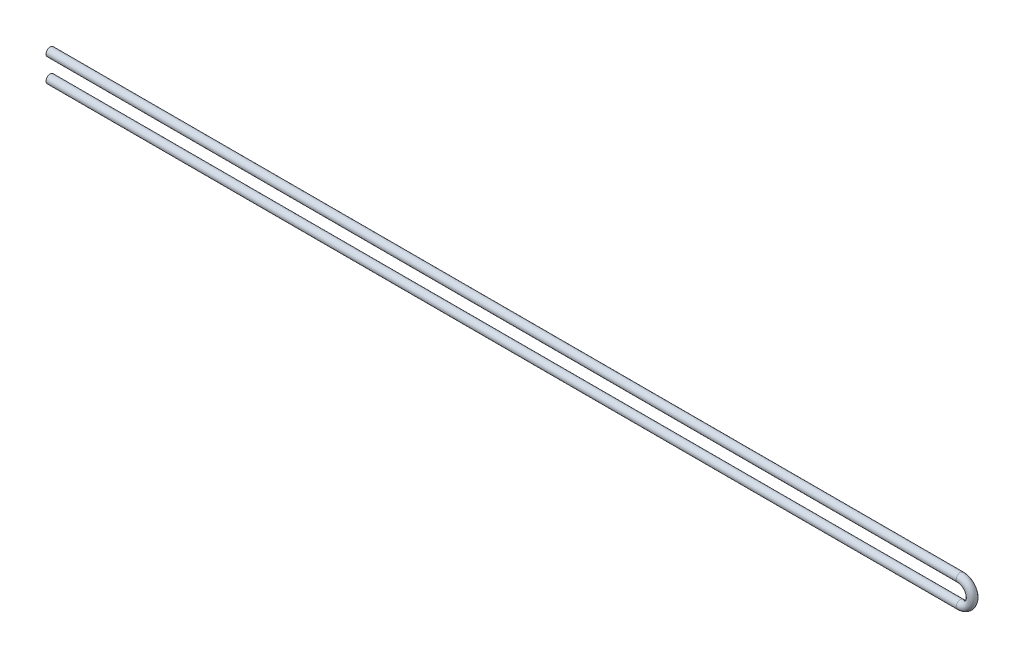
ISO-10303-21;
HEADER;
FILE_DESCRIPTION(('STEP AP214'),'2;1');
FILE_NAME('part.step','',(''),(''),'','','');
FILE_SCHEMA(('AUTOMOTIVE_DESIGN { 1 0 10303 214 1 1 1 1 }'));
ENDSEC;
DATA;
#1=APPLICATION_CONTEXT('core data for automotive mechanical design processes');
#2=APPLICATION_PROTOCOL_DEFINITION('international standard','automotive_design',2000,#1);
#3=PRODUCT_CONTEXT('',#1,'mechanical');
#4=PRODUCT('Part','Part','',(#3));
#5=PRODUCT_RELATED_PRODUCT_CATEGORY('part','',(#4));
#6=PRODUCT_DEFINITION_FORMATION('','',#4);
#7=PRODUCT_DEFINITION_CONTEXT('part definition',#1,'design');
#8=PRODUCT_DEFINITION('design','',#6,#7);
#9=PRODUCT_DEFINITION_SHAPE('','',#8);
#10=(LENGTH_UNIT() NAMED_UNIT(*) SI_UNIT(.MILLI.,.METRE.));
#11=(NAMED_UNIT(*) PLANE_ANGLE_UNIT() SI_UNIT($,.RADIAN.));
#12=(NAMED_UNIT(*) SI_UNIT($,.STERADIAN.) SOLID_ANGLE_UNIT());
#13=UNCERTAINTY_MEASURE_WITH_UNIT(LENGTH_MEASURE(1.E-05),#10,'distance_accuracy_value','');
#14=(GEOMETRIC_REPRESENTATION_CONTEXT(3) GLOBAL_UNCERTAINTY_ASSIGNED_CONTEXT((#13)) GLOBAL_UNIT_ASSIGNED_CONTEXT((#10,
#11,#12)) REPRESENTATION_CONTEXT('',''));
#15=CARTESIAN_POINT('',(0.,0.,0.));
#16=DIRECTION('',(0.,0.,1.));
#17=DIRECTION('',(1.,0.,0.));
#18=AXIS2_PLACEMENT_3D('',#15,#16,#17);
#19=CARTESIAN_POINT('',(0.,0.,0.));
#20=DIRECTION('',(-1.,0.,0.));
#21=DIRECTION('',(0.,-1.,0.));
#22=AXIS2_PLACEMENT_3D('',#19,#20,#21);
#23=PLANE('',#22);
#24=CARTESIAN_POINT('',(0.,0.,0.));
#25=DIRECTION('',(-1.,0.,0.));
#26=DIRECTION('',(0.,-1.,0.));
#27=AXIS2_PLACEMENT_3D('',#24,#25,#26);
#28=CIRCLE('',#27,10.15);
#29=CARTESIAN_POINT('',(0.,-10.15,0.));
#30=VERTEX_POINT('',#29);
#31=EDGE_CURVE('E72',#30,#30,#28,.T.);
#32=ORIENTED_EDGE('',*,*,#31,.F.);
#33=EDGE_LOOP('',(#32));
#34=FACE_BOUND('',#33,.T.);
#35=CARTESIAN_POINT('',(0.,0.,0.));
#36=DIRECTION('',(-1.,0.,0.));
#37=DIRECTION('',(0.,-1.,0.));
#38=AXIS2_PLACEMENT_3D('',#35,#36,#37);
#39=CIRCLE('',#38,10.65);
#40=CARTESIAN_POINT('',(0.,-10.65,0.));
#41=VERTEX_POINT('',#40);
#42=EDGE_CURVE('E63',#41,#41,#39,.T.);
#43=ORIENTED_EDGE('',*,*,#42,.T.);
#44=EDGE_LOOP('',(#43));
#45=FACE_BOUND('',#44,.T.);
#46=ADVANCED_FACE('F49',(#34,#45),#23,.T.);
#47=CARTESIAN_POINT('',(0.,-60.0000000000003,0.));
#48=DIRECTION('',(1.,0.,0.));
#49=DIRECTION('',(0.,1.,0.));
#50=AXIS2_PLACEMENT_3D('',#47,#48,#49);
#51=PLANE('',#50);
#52=CARTESIAN_POINT('',(0.,-60.0000000000003,0.));
#53=DIRECTION('',(1.,0.,0.));
#54=DIRECTION('',(0.,1.,0.));
#55=AXIS2_PLACEMENT_3D('',#52,#53,#54);
#56=CIRCLE('',#55,10.15);
#57=CARTESIAN_POINT('',(0.,-49.8500000000003,0.));
#58=VERTEX_POINT('',#57);
#59=EDGE_CURVE('E68',#58,#58,#56,.T.);
#60=ORIENTED_EDGE('',*,*,#59,.T.);
#61=EDGE_LOOP('',(#60));
#62=FACE_BOUND('',#61,.T.);
#63=CARTESIAN_POINT('',(0.,-60.0000000000003,0.));
#64=DIRECTION('',(1.,0.,0.));
#65=DIRECTION('',(0.,1.,0.));
#66=AXIS2_PLACEMENT_3D('',#63,#64,#65);
#67=CIRCLE('',#66,10.65);
#68=CARTESIAN_POINT('',(0.,-49.3500000000003,0.));
#69=VERTEX_POINT('',#68);
#70=EDGE_CURVE('E11',#69,#69,#67,.T.);
#71=ORIENTED_EDGE('',*,*,#70,.F.);
#72=EDGE_LOOP('',(#71));
#73=FACE_BOUND('',#72,.T.);
#74=ADVANCED_FACE('F92',(#62,#73),#51,.F.);
#75=CARTESIAN_POINT('',(0.,0.,0.));
#76=DIRECTION('',(1.,0.,0.));
#77=DIRECTION('',(0.,0.,-1.));
#78=AXIS2_PLACEMENT_3D('',#75,#76,#77);
#79=CYLINDRICAL_SURFACE('',#78,10.65);
#80=CARTESIAN_POINT('',(2325.,0.,0.));
#81=DIRECTION('',(-1.,0.,0.));
#82=DIRECTION('',(0.,-1.,0.));
#83=AXIS2_PLACEMENT_3D('',#80,#81,#82);
#84=CIRCLE('',#83,10.65);
#85=CARTESIAN_POINT('',(2325.,10.6499999999999,0.));
#86=VERTEX_POINT('',#85);
#87=EDGE_CURVE('E59',#86,#86,#84,.T.);
#88=ORIENTED_EDGE('',*,*,#87,.T.);
#89=EDGE_LOOP('',(#88));
#90=FACE_BOUND('',#89,.T.);
#91=ORIENTED_EDGE('',*,*,#42,.F.);
#92=EDGE_LOOP('',(#91));
#93=FACE_BOUND('',#92,.T.);
#94=ADVANCED_FACE('F96',(#90,#93),#79,.T.);
#95=CARTESIAN_POINT('',(2325.,-30.,0.));
#96=DIRECTION('',(0.,0.,-1.));
#97=DIRECTION('',(-1.,0.,0.));
#98=AXIS2_PLACEMENT_3D('',#95,#96,#97);
#99=TOROIDAL_SURFACE('',#98,30.,10.65);
#100=CARTESIAN_POINT('',(2325.,-60.,0.));
#101=DIRECTION('',(1.,0.,0.));
#102=DIRECTION('',(0.,1.,0.));
#103=AXIS2_PLACEMENT_3D('',#100,#101,#102);
#104=CIRCLE('',#103,10.65);
#105=CARTESIAN_POINT('',(2325.,-70.65,0.));
#106=VERTEX_POINT('',#105);
#107=EDGE_CURVE('E55',#106,#106,#104,.T.);
#108=CARTESIAN_POINT('',(2325.,-30.,0.));
#109=DIRECTION('',(0.,0.,-1.));
#110=DIRECTION('',(-1.,0.,0.));
#111=AXIS2_PLACEMENT_3D('',#108,#109,#110);
#112=CIRCLE('',#111,40.65);
#113=EDGE_CURVE('',#86,#106,#112,.T.);
#114=ORIENTED_EDGE('',*,*,#87,.F.);
#115=ORIENTED_EDGE('',*,*,#107,.T.);
#116=ORIENTED_EDGE('',*,*,#113,.T.);
#117=ORIENTED_EDGE('',*,*,#113,.F.);
#118=EDGE_LOOP('',(#114,#116,#115,#117));
#119=FACE_BOUND('',#118,.T.);
#120=ADVANCED_FACE('F98',(#119),#99,.T.);
#121=CARTESIAN_POINT('',(2325.,-59.9999999999999,0.));
#122=DIRECTION('',(-1.,0.,0.));
#123=DIRECTION('',(0.,-1.,0.));
#124=AXIS2_PLACEMENT_3D('',#121,#122,#123);
#125=CYLINDRICAL_SURFACE('',#124,10.65);
#126=ORIENTED_EDGE('',*,*,#70,.T.);
#127=EDGE_LOOP('',(#126));
#128=FACE_BOUND('',#127,.T.);
#129=ORIENTED_EDGE('',*,*,#107,.F.);
#130=EDGE_LOOP('',(#129));
#131=FACE_BOUND('',#130,.T.);
#132=ADVANCED_FACE('F86',(#128,#131),#125,.T.);
#133=CARTESIAN_POINT('',(0.,0.,0.));
#134=DIRECTION('',(1.,0.,0.));
#135=DIRECTION('',(0.,0.,-1.));
#136=AXIS2_PLACEMENT_3D('',#133,#134,#135);
#137=CYLINDRICAL_SURFACE('',#136,10.15);
#138=CARTESIAN_POINT('',(2325.,0.,0.));
#139=DIRECTION('',(1.,0.,0.));
#140=DIRECTION('',(0.,0.,-1.));
#141=AXIS2_PLACEMENT_3D('',#138,#139,#140);
#142=CIRCLE('',#141,10.15);
#143=CARTESIAN_POINT('',(2325.,10.1499999999999,0.));
#144=VERTEX_POINT('',#143);
#145=EDGE_CURVE('E75',#144,#144,#142,.F.);
#146=ORIENTED_EDGE('',*,*,#145,.F.);
#147=EDGE_LOOP('',(#146));
#148=FACE_BOUND('',#147,.T.);
#149=ORIENTED_EDGE('',*,*,#31,.T.);
#150=EDGE_LOOP('',(#149));
#151=FACE_BOUND('',#150,.T.);
#152=ADVANCED_FACE('F83',(#148,#151),#137,.F.);
#153=CARTESIAN_POINT('',(2325.,-30.,0.));
#154=DIRECTION('',(0.,0.,-1.));
#155=DIRECTION('',(-1.,0.,0.));
#156=AXIS2_PLACEMENT_3D('',#153,#154,#155);
#157=TOROIDAL_SURFACE('',#156,30.,10.15);
#158=CARTESIAN_POINT('',(2325.,-60.,0.));
#159=DIRECTION('',(1.,0.,0.));
#160=DIRECTION('',(0.,1.,0.));
#161=AXIS2_PLACEMENT_3D('',#158,#159,#160);
#162=CIRCLE('',#161,10.15);
#163=CARTESIAN_POINT('',(2325.,-70.15,0.));
#164=VERTEX_POINT('',#163);
#165=EDGE_CURVE('E71',#164,#164,#162,.T.);
#166=CARTESIAN_POINT('',(2325.,-30.,0.));
#167=DIRECTION('',(0.,0.,-1.));
#168=DIRECTION('',(-1.,0.,0.));
#169=AXIS2_PLACEMENT_3D('',#166,#167,#168);
#170=CIRCLE('',#169,40.15);
#171=EDGE_CURVE('',#144,#164,#170,.T.);
#172=ORIENTED_EDGE('',*,*,#145,.T.);
#173=ORIENTED_EDGE('',*,*,#165,.F.);
#174=ORIENTED_EDGE('',*,*,#171,.T.);
#175=ORIENTED_EDGE('',*,*,#171,.F.);
#176=EDGE_LOOP('',(#172,#174,#173,#175));
#177=FACE_BOUND('',#176,.T.);
#178=ADVANCED_FACE('F81',(#177),#157,.F.);
#179=CARTESIAN_POINT('',(2325.,-59.9999999999999,0.));
#180=DIRECTION('',(-1.,0.,0.));
#181=DIRECTION('',(0.,-1.,0.));
#182=AXIS2_PLACEMENT_3D('',#179,#180,#181);
#183=CYLINDRICAL_SURFACE('',#182,10.15);
#184=ORIENTED_EDGE('',*,*,#59,.F.);
#185=EDGE_LOOP('',(#184));
#186=FACE_BOUND('',#185,.T.);
#187=ORIENTED_EDGE('',*,*,#165,.T.);
#188=EDGE_LOOP('',(#187));
#189=FACE_BOUND('',#188,.T.);
#190=ADVANCED_FACE('F93',(#186,#189),#183,.F.);
#191=CLOSED_SHELL('',(#46,#74,#94,#120,#132,#152,#178,#190));
#192=MANIFOLD_SOLID_BREP('B2',#191);
#193=ADVANCED_BREP_SHAPE_REPRESENTATION('',(#18,#192),#14);
#194=SHAPE_DEFINITION_REPRESENTATION(#9,#193);
ENDSEC;
END-ISO-10303-21;
